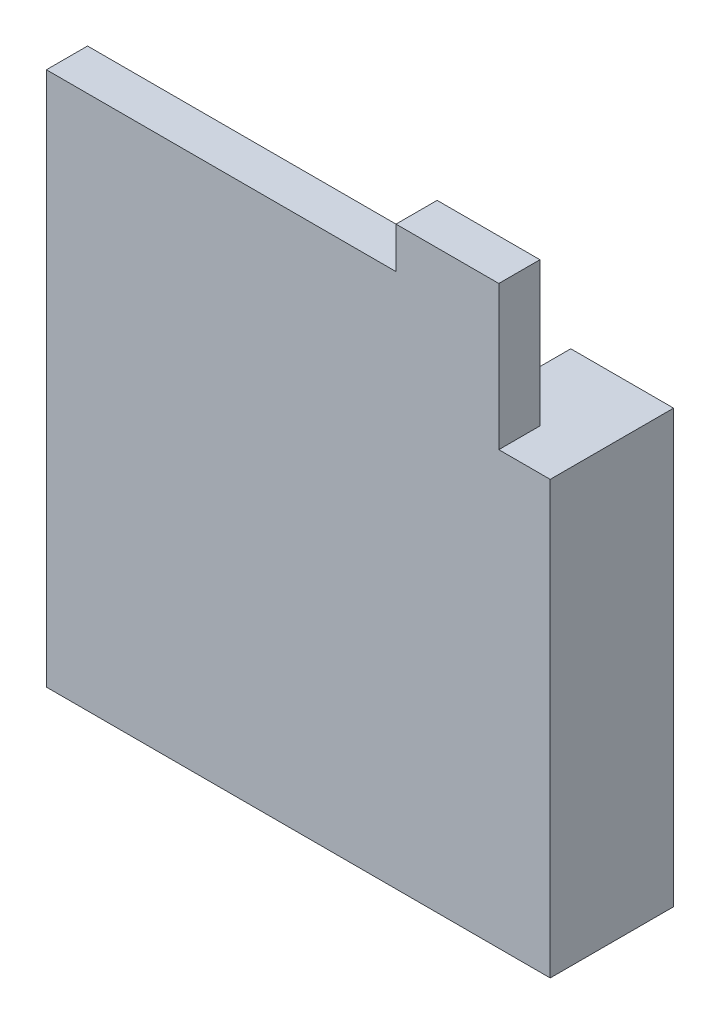
ISO-10303-21;
HEADER;
FILE_DESCRIPTION(('STEP AP214'),'2;1');
FILE_NAME('part.step','',(''),(''),'','','');
FILE_SCHEMA(('AUTOMOTIVE_DESIGN { 1 0 10303 214 1 1 1 1 }'));
ENDSEC;
DATA;
#1=APPLICATION_CONTEXT('core data for automotive mechanical design processes');
#2=APPLICATION_PROTOCOL_DEFINITION('international standard','automotive_design',2000,#1);
#3=PRODUCT_CONTEXT('',#1,'mechanical');
#4=PRODUCT('Part','Part','',(#3));
#5=PRODUCT_RELATED_PRODUCT_CATEGORY('part','',(#4));
#6=PRODUCT_DEFINITION_FORMATION('','',#4);
#7=PRODUCT_DEFINITION_CONTEXT('part definition',#1,'design');
#8=PRODUCT_DEFINITION('design','',#6,#7);
#9=PRODUCT_DEFINITION_SHAPE('','',#8);
#10=(LENGTH_UNIT() NAMED_UNIT(*) SI_UNIT(.MILLI.,.METRE.));
#11=(NAMED_UNIT(*) PLANE_ANGLE_UNIT() SI_UNIT($,.RADIAN.));
#12=(NAMED_UNIT(*) SI_UNIT($,.STERADIAN.) SOLID_ANGLE_UNIT());
#13=UNCERTAINTY_MEASURE_WITH_UNIT(LENGTH_MEASURE(1.E-05),#10,'distance_accuracy_value','');
#14=(GEOMETRIC_REPRESENTATION_CONTEXT(3) GLOBAL_UNCERTAINTY_ASSIGNED_CONTEXT((#13)) GLOBAL_UNIT_ASSIGNED_CONTEXT((#10,
#11,#12)) REPRESENTATION_CONTEXT('',''));
#15=CARTESIAN_POINT('',(0.,0.,0.));
#16=DIRECTION('',(0.,0.,1.));
#17=DIRECTION('',(1.,0.,0.));
#18=AXIS2_PLACEMENT_3D('',#15,#16,#17);
#19=CARTESIAN_POINT('',(0.,0.,-1.));
#20=DIRECTION('',(0.,0.,1.));
#21=DIRECTION('',(1.,0.,0.));
#22=AXIS2_PLACEMENT_3D('',#19,#20,#21);
#23=PLANE('',#22);
#24=DIRECTION('',(0.,1.,0.));
#25=VECTOR('',#24,1.);
#26=CARTESIAN_POINT('',(4.25,0.,-1.));
#27=LINE('',#26,#25);
#28=CARTESIAN_POINT('',(4.25,-6.5,-1.));
#29=VERTEX_POINT('',#28);
#30=CARTESIAN_POINT('',(4.25,4.,-1.));
#31=VERTEX_POINT('',#30);
#32=EDGE_CURVE('E138',#29,#31,#27,.T.);
#33=ORIENTED_EDGE('',*,*,#32,.F.);
#34=DIRECTION('',(1.,0.,0.));
#35=VECTOR('',#34,1.);
#36=CARTESIAN_POINT('',(0.,-6.5,-1.));
#37=LINE('',#36,#35);
#38=CARTESIAN_POINT('',(-5.5,-6.5,-1.));
#39=VERTEX_POINT('',#38);
#40=EDGE_CURVE('E152',#39,#29,#37,.T.);
#41=ORIENTED_EDGE('',*,*,#40,.F.);
#42=DIRECTION('',(0.,-1.,0.));
#43=VECTOR('',#42,1.);
#44=CARTESIAN_POINT('',(-5.5,0.,-1.));
#45=LINE('',#44,#43);
#46=CARTESIAN_POINT('',(-5.5,6.5,-1.));
#47=VERTEX_POINT('',#46);
#48=EDGE_CURVE('E94',#47,#39,#45,.T.);
#49=ORIENTED_EDGE('',*,*,#48,.F.);
#50=DIRECTION('',(-1.,0.,0.));
#51=VECTOR('',#50,1.);
#52=CARTESIAN_POINT('',(0.,6.5,-1.));
#53=LINE('',#52,#51);
#54=CARTESIAN_POINT('',(3.,6.5,-1.));
#55=VERTEX_POINT('',#54);
#56=EDGE_CURVE('E129',#55,#47,#53,.T.);
#57=ORIENTED_EDGE('',*,*,#56,.F.);
#58=DIRECTION('',(0.,-1.,0.));
#59=VECTOR('',#58,1.);
#60=CARTESIAN_POINT('',(3.,0.,-1.));
#61=LINE('',#60,#59);
#62=CARTESIAN_POINT('',(3.,7.5,-1.));
#63=VERTEX_POINT('',#62);
#64=EDGE_CURVE('E117',#63,#55,#61,.T.);
#65=ORIENTED_EDGE('',*,*,#64,.F.);
#66=DIRECTION('',(-1.,0.,0.));
#67=VECTOR('',#66,1.);
#68=CARTESIAN_POINT('',(0.,7.5,-1.));
#69=LINE('',#68,#67);
#70=CARTESIAN_POINT('',(5.5,7.5,-1.));
#71=VERTEX_POINT('',#70);
#72=EDGE_CURVE('E106',#71,#63,#69,.T.);
#73=ORIENTED_EDGE('',*,*,#72,.F.);
#74=DIRECTION('',(0.,1.,0.));
#75=VECTOR('',#74,1.);
#76=CARTESIAN_POINT('',(5.5,0.,-1.));
#77=LINE('',#76,#75);
#78=CARTESIAN_POINT('',(5.5,4.,-1.));
#79=VERTEX_POINT('',#78);
#80=EDGE_CURVE('E116',#79,#71,#77,.T.);
#81=ORIENTED_EDGE('',*,*,#80,.F.);
#82=DIRECTION('',(1.,0.,0.));
#83=VECTOR('',#82,1.);
#84=CARTESIAN_POINT('',(0.,4.,-1.));
#85=LINE('',#84,#83);
#86=EDGE_CURVE('E59',#31,#79,#85,.T.);
#87=ORIENTED_EDGE('',*,*,#86,.F.);
#88=EDGE_LOOP('',(#33,#41,#49,#57,#65,#73,#81,#87));
#89=FACE_BOUND('',#88,.T.);
#90=ADVANCED_FACE('F35',(#89),#23,.F.);
#91=CARTESIAN_POINT('',(6.75,0.,-1.));
#92=DIRECTION('',(-1.,0.,0.));
#93=DIRECTION('',(0.,0.,1.));
#94=AXIS2_PLACEMENT_3D('',#91,#92,#93);
#95=PLANE('',#94);
#96=DIRECTION('',(0.,0.,1.));
#97=VECTOR('',#96,1.);
#98=CARTESIAN_POINT('',(6.75,-6.5,-1.));
#99=LINE('',#98,#97);
#100=CARTESIAN_POINT('',(6.75,-6.5,-3.));
#101=VERTEX_POINT('',#100);
#102=CARTESIAN_POINT('',(6.75,-6.5,0.));
#103=VERTEX_POINT('',#102);
#104=EDGE_CURVE('E43',#101,#103,#99,.T.);
#105=ORIENTED_EDGE('',*,*,#104,.F.);
#106=DIRECTION('',(0.,-1.,0.));
#107=VECTOR('',#106,1.);
#108=CARTESIAN_POINT('',(6.75,4.,-3.));
#109=LINE('',#108,#107);
#110=CARTESIAN_POINT('',(6.75,4.,-3.));
#111=VERTEX_POINT('',#110);
#112=EDGE_CURVE('E189',#111,#101,#109,.T.);
#113=ORIENTED_EDGE('',*,*,#112,.F.);
#114=DIRECTION('',(0.,0.,1.));
#115=VECTOR('',#114,1.);
#116=CARTESIAN_POINT('',(6.75,4.,-1.));
#117=LINE('',#116,#115);
#118=CARTESIAN_POINT('',(6.75,4.,0.));
#119=VERTEX_POINT('',#118);
#120=EDGE_CURVE('E154',#111,#119,#117,.T.);
#121=ORIENTED_EDGE('',*,*,#120,.T.);
#122=DIRECTION('',(0.,-1.,0.));
#123=VECTOR('',#122,1.);
#124=CARTESIAN_POINT('',(6.75,0.,0.));
#125=LINE('',#124,#123);
#126=EDGE_CURVE('E11',#119,#103,#125,.T.);
#127=ORIENTED_EDGE('',*,*,#126,.T.);
#128=EDGE_LOOP('',(#105,#113,#121,#127));
#129=FACE_BOUND('',#128,.T.);
#130=ADVANCED_FACE('F37',(#129),#95,.F.);
#131=CARTESIAN_POINT('',(0.,0.,0.));
#132=DIRECTION('',(0.,0.,1.));
#133=DIRECTION('',(1.,0.,0.));
#134=AXIS2_PLACEMENT_3D('',#131,#132,#133);
#135=PLANE('',#134);
#136=DIRECTION('',(1.,0.,0.));
#137=VECTOR('',#136,1.);
#138=CARTESIAN_POINT('',(0.,-6.5,0.));
#139=LINE('',#138,#137);
#140=CARTESIAN_POINT('',(-5.5,-6.5,0.));
#141=VERTEX_POINT('',#140);
#142=EDGE_CURVE('E50',#141,#103,#139,.T.);
#143=ORIENTED_EDGE('',*,*,#142,.T.);
#144=ORIENTED_EDGE('',*,*,#126,.F.);
#145=DIRECTION('',(-1.,0.,0.));
#146=VECTOR('',#145,1.);
#147=CARTESIAN_POINT('',(0.,4.,0.));
#148=LINE('',#147,#146);
#149=CARTESIAN_POINT('',(5.5,4.,0.));
#150=VERTEX_POINT('',#149);
#151=EDGE_CURVE('E149',#119,#150,#148,.T.);
#152=ORIENTED_EDGE('',*,*,#151,.T.);
#153=DIRECTION('',(0.,1.,0.));
#154=VECTOR('',#153,1.);
#155=CARTESIAN_POINT('',(5.5,0.,0.));
#156=LINE('',#155,#154);
#157=CARTESIAN_POINT('',(5.5,7.5,0.));
#158=VERTEX_POINT('',#157);
#159=EDGE_CURVE('E146',#150,#158,#156,.T.);
#160=ORIENTED_EDGE('',*,*,#159,.T.);
#161=DIRECTION('',(-1.,0.,0.));
#162=VECTOR('',#161,1.);
#163=CARTESIAN_POINT('',(0.,7.5,0.));
#164=LINE('',#163,#162);
#165=CARTESIAN_POINT('',(3.,7.5,0.));
#166=VERTEX_POINT('',#165);
#167=EDGE_CURVE('E144',#158,#166,#164,.T.);
#168=ORIENTED_EDGE('',*,*,#167,.T.);
#169=DIRECTION('',(0.,-1.,0.));
#170=VECTOR('',#169,1.);
#171=CARTESIAN_POINT('',(3.,0.,0.));
#172=LINE('',#171,#170);
#173=CARTESIAN_POINT('',(3.,6.5,0.));
#174=VERTEX_POINT('',#173);
#175=EDGE_CURVE('E123',#166,#174,#172,.T.);
#176=ORIENTED_EDGE('',*,*,#175,.T.);
#177=DIRECTION('',(-1.,0.,0.));
#178=VECTOR('',#177,1.);
#179=CARTESIAN_POINT('',(0.,6.5,0.));
#180=LINE('',#179,#178);
#181=CARTESIAN_POINT('',(-5.5,6.5,0.));
#182=VERTEX_POINT('',#181);
#183=EDGE_CURVE('E140',#174,#182,#180,.T.);
#184=ORIENTED_EDGE('',*,*,#183,.T.);
#185=DIRECTION('',(0.,-1.,0.));
#186=VECTOR('',#185,1.);
#187=CARTESIAN_POINT('',(-5.5,0.,0.));
#188=LINE('',#187,#186);
#189=EDGE_CURVE('E137',#182,#141,#188,.T.);
#190=ORIENTED_EDGE('',*,*,#189,.T.);
#191=EDGE_LOOP('',(#143,#144,#152,#160,#168,#176,#184,#190));
#192=FACE_BOUND('',#191,.T.);
#193=ADVANCED_FACE('F166',(#192),#135,.T.);
#194=CARTESIAN_POINT('',(0.,-6.5,-1.));
#195=DIRECTION('',(0.,-1.,0.));
#196=DIRECTION('',(0.,0.,-1.));
#197=AXIS2_PLACEMENT_3D('',#194,#195,#196);
#198=PLANE('',#197);
#199=ORIENTED_EDGE('',*,*,#104,.T.);
#200=ORIENTED_EDGE('',*,*,#142,.F.);
#201=DIRECTION('',(0.,0.,1.));
#202=VECTOR('',#201,1.);
#203=CARTESIAN_POINT('',(-5.5,-6.5,-1.));
#204=LINE('',#203,#202);
#205=EDGE_CURVE('E135',#39,#141,#204,.T.);
#206=ORIENTED_EDGE('',*,*,#205,.F.);
#207=ORIENTED_EDGE('',*,*,#40,.T.);
#208=DIRECTION('',(0.,0.,1.));
#209=VECTOR('',#208,1.);
#210=CARTESIAN_POINT('',(4.25,-6.5,-3.));
#211=LINE('',#210,#209);
#212=CARTESIAN_POINT('',(4.25,-6.5,-3.));
#213=VERTEX_POINT('',#212);
#214=EDGE_CURVE('E175',#213,#29,#211,.T.);
#215=ORIENTED_EDGE('',*,*,#214,.F.);
#216=DIRECTION('',(-1.,0.,0.));
#217=VECTOR('',#216,1.);
#218=CARTESIAN_POINT('',(6.75,-6.5,-3.));
#219=LINE('',#218,#217);
#220=EDGE_CURVE('E186',#101,#213,#219,.T.);
#221=ORIENTED_EDGE('',*,*,#220,.F.);
#222=EDGE_LOOP('',(#199,#200,#206,#207,#215,#221));
#223=FACE_BOUND('',#222,.T.);
#224=ADVANCED_FACE('F216',(#223),#198,.T.);
#225=CARTESIAN_POINT('',(0.,4.,-1.));
#226=DIRECTION('',(0.,1.,0.));
#227=DIRECTION('',(0.,0.,1.));
#228=AXIS2_PLACEMENT_3D('',#225,#226,#227);
#229=PLANE('',#228);
#230=ORIENTED_EDGE('',*,*,#151,.F.);
#231=ORIENTED_EDGE('',*,*,#120,.F.);
#232=DIRECTION('',(1.,0.,0.));
#233=VECTOR('',#232,1.);
#234=CARTESIAN_POINT('',(6.75,4.,-3.));
#235=LINE('',#234,#233);
#236=CARTESIAN_POINT('',(4.25,4.,-3.));
#237=VERTEX_POINT('',#236);
#238=EDGE_CURVE('E180',#237,#111,#235,.T.);
#239=ORIENTED_EDGE('',*,*,#238,.F.);
#240=DIRECTION('',(0.,0.,1.));
#241=VECTOR('',#240,1.);
#242=CARTESIAN_POINT('',(4.25,4.,-3.));
#243=LINE('',#242,#241);
#244=EDGE_CURVE('E178',#237,#31,#243,.T.);
#245=ORIENTED_EDGE('',*,*,#244,.T.);
#246=ORIENTED_EDGE('',*,*,#86,.T.);
#247=DIRECTION('',(0.,0.,1.));
#248=VECTOR('',#247,1.);
#249=CARTESIAN_POINT('',(5.5,4.,-1.));
#250=LINE('',#249,#248);
#251=EDGE_CURVE('E157',#79,#150,#250,.T.);
#252=ORIENTED_EDGE('',*,*,#251,.T.);
#253=EDGE_LOOP('',(#230,#231,#239,#245,#246,#252));
#254=FACE_BOUND('',#253,.T.);
#255=ADVANCED_FACE('F213',(#254),#229,.T.);
#256=CARTESIAN_POINT('',(5.5,0.,-1.));
#257=DIRECTION('',(1.,0.,0.));
#258=DIRECTION('',(0.,0.,-1.));
#259=AXIS2_PLACEMENT_3D('',#256,#257,#258);
#260=PLANE('',#259);
#261=ORIENTED_EDGE('',*,*,#159,.F.);
#262=ORIENTED_EDGE('',*,*,#251,.F.);
#263=ORIENTED_EDGE('',*,*,#80,.T.);
#264=DIRECTION('',(0.,0.,1.));
#265=VECTOR('',#264,1.);
#266=CARTESIAN_POINT('',(5.5,7.5,-1.));
#267=LINE('',#266,#265);
#268=EDGE_CURVE('E112',#71,#158,#267,.T.);
#269=ORIENTED_EDGE('',*,*,#268,.T.);
#270=EDGE_LOOP('',(#261,#262,#263,#269));
#271=FACE_BOUND('',#270,.T.);
#272=ADVANCED_FACE('F215',(#271),#260,.T.);
#273=CARTESIAN_POINT('',(0.,7.5,-1.));
#274=DIRECTION('',(0.,1.,0.));
#275=DIRECTION('',(0.,0.,1.));
#276=AXIS2_PLACEMENT_3D('',#273,#274,#275);
#277=PLANE('',#276);
#278=ORIENTED_EDGE('',*,*,#167,.F.);
#279=ORIENTED_EDGE('',*,*,#268,.F.);
#280=ORIENTED_EDGE('',*,*,#72,.T.);
#281=DIRECTION('',(0.,0.,1.));
#282=VECTOR('',#281,1.);
#283=CARTESIAN_POINT('',(3.,7.5,-1.));
#284=LINE('',#283,#282);
#285=EDGE_CURVE('E110',#63,#166,#284,.T.);
#286=ORIENTED_EDGE('',*,*,#285,.T.);
#287=EDGE_LOOP('',(#278,#279,#280,#286));
#288=FACE_BOUND('',#287,.T.);
#289=ADVANCED_FACE('F109',(#288),#277,.T.);
#290=CARTESIAN_POINT('',(3.,0.,-1.));
#291=DIRECTION('',(-1.,0.,0.));
#292=DIRECTION('',(0.,0.,1.));
#293=AXIS2_PLACEMENT_3D('',#290,#291,#292);
#294=PLANE('',#293);
#295=ORIENTED_EDGE('',*,*,#175,.F.);
#296=ORIENTED_EDGE('',*,*,#285,.F.);
#297=ORIENTED_EDGE('',*,*,#64,.T.);
#298=DIRECTION('',(0.,0.,1.));
#299=VECTOR('',#298,1.);
#300=CARTESIAN_POINT('',(3.,6.5,-1.));
#301=LINE('',#300,#299);
#302=EDGE_CURVE('E125',#55,#174,#301,.T.);
#303=ORIENTED_EDGE('',*,*,#302,.T.);
#304=EDGE_LOOP('',(#295,#296,#297,#303));
#305=FACE_BOUND('',#304,.T.);
#306=ADVANCED_FACE('F120',(#305),#294,.T.);
#307=CARTESIAN_POINT('',(0.,6.5,-1.));
#308=DIRECTION('',(0.,1.,0.));
#309=DIRECTION('',(0.,0.,1.));
#310=AXIS2_PLACEMENT_3D('',#307,#308,#309);
#311=PLANE('',#310);
#312=ORIENTED_EDGE('',*,*,#183,.F.);
#313=ORIENTED_EDGE('',*,*,#302,.F.);
#314=ORIENTED_EDGE('',*,*,#56,.T.);
#315=DIRECTION('',(0.,0.,1.));
#316=VECTOR('',#315,1.);
#317=CARTESIAN_POINT('',(-5.5,6.5,-1.));
#318=LINE('',#317,#316);
#319=EDGE_CURVE('E161',#47,#182,#318,.T.);
#320=ORIENTED_EDGE('',*,*,#319,.T.);
#321=EDGE_LOOP('',(#312,#313,#314,#320));
#322=FACE_BOUND('',#321,.T.);
#323=ADVANCED_FACE('F169',(#322),#311,.T.);
#324=CARTESIAN_POINT('',(-5.5,0.,-1.));
#325=DIRECTION('',(-1.,0.,0.));
#326=DIRECTION('',(0.,0.,1.));
#327=AXIS2_PLACEMENT_3D('',#324,#325,#326);
#328=PLANE('',#327);
#329=ORIENTED_EDGE('',*,*,#189,.F.);
#330=ORIENTED_EDGE('',*,*,#319,.F.);
#331=ORIENTED_EDGE('',*,*,#48,.T.);
#332=ORIENTED_EDGE('',*,*,#205,.T.);
#333=EDGE_LOOP('',(#329,#330,#331,#332));
#334=FACE_BOUND('',#333,.T.);
#335=ADVANCED_FACE('F163',(#334),#328,.T.);
#336=CARTESIAN_POINT('',(4.25,4.,-3.));
#337=DIRECTION('',(1.,0.,0.));
#338=DIRECTION('',(0.,1.,0.));
#339=AXIS2_PLACEMENT_3D('',#336,#337,#338);
#340=PLANE('',#339);
#341=ORIENTED_EDGE('',*,*,#214,.T.);
#342=ORIENTED_EDGE('',*,*,#32,.T.);
#343=ORIENTED_EDGE('',*,*,#244,.F.);
#344=DIRECTION('',(0.,1.,0.));
#345=VECTOR('',#344,1.);
#346=CARTESIAN_POINT('',(4.25,4.,-3.));
#347=LINE('',#346,#345);
#348=EDGE_CURVE('E183',#213,#237,#347,.T.);
#349=ORIENTED_EDGE('',*,*,#348,.F.);
#350=EDGE_LOOP('',(#341,#342,#343,#349));
#351=FACE_BOUND('',#350,.T.);
#352=ADVANCED_FACE('F212',(#351),#340,.F.);
#353=CARTESIAN_POINT('',(0.,0.,-3.));
#354=DIRECTION('',(0.,0.,-1.));
#355=DIRECTION('',(-1.,0.,0.));
#356=AXIS2_PLACEMENT_3D('',#353,#354,#355);
#357=PLANE('',#356);
#358=ORIENTED_EDGE('',*,*,#112,.T.);
#359=ORIENTED_EDGE('',*,*,#220,.T.);
#360=ORIENTED_EDGE('',*,*,#348,.T.);
#361=ORIENTED_EDGE('',*,*,#238,.T.);
#362=EDGE_LOOP('',(#358,#359,#360,#361));
#363=FACE_BOUND('',#362,.T.);
#364=ADVANCED_FACE('F194',(#363),#357,.T.);
#365=CLOSED_SHELL('',(#90,#130,#193,#224,#255,#272,#289,#306,#323,#335,#352,#364));
#366=MANIFOLD_SOLID_BREP('B2',#365);
#367=ADVANCED_BREP_SHAPE_REPRESENTATION('',(#18,#366),#14);
#368=SHAPE_DEFINITION_REPRESENTATION(#9,#367);
ENDSEC;
END-ISO-10303-21;
